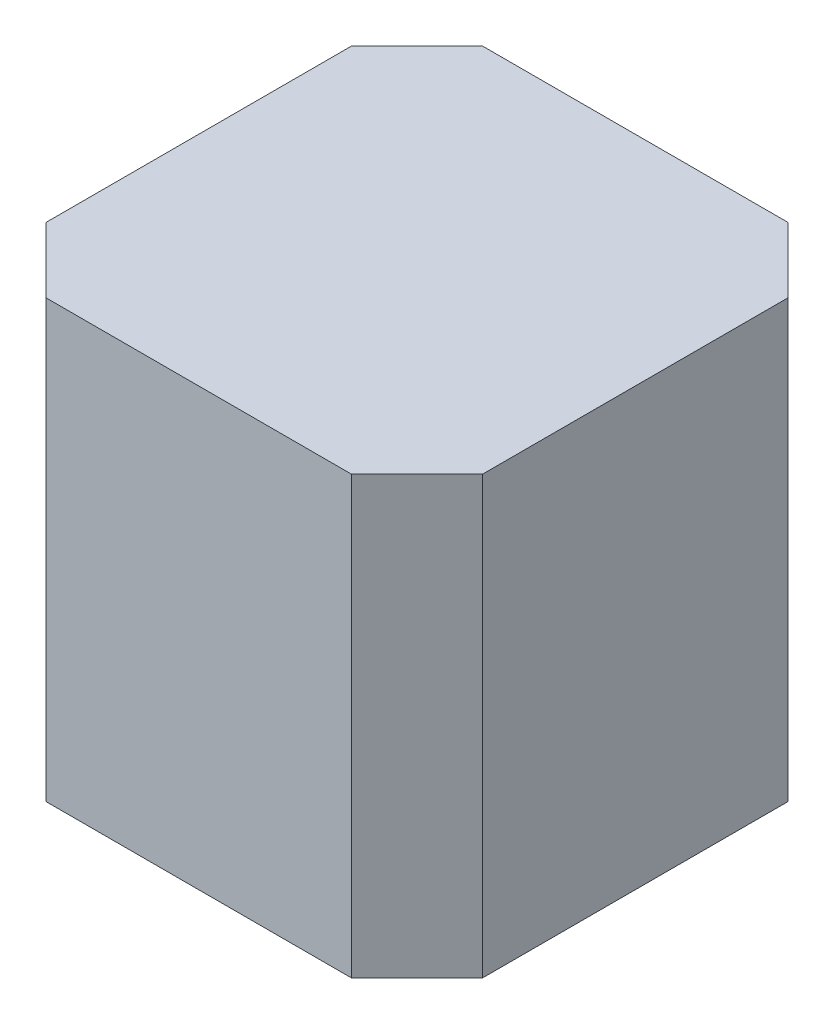
ISO-10303-21;
HEADER;
FILE_DESCRIPTION(('STEP AP214'),'2;1');
FILE_NAME('part.step','',(''),(''),'','','');
FILE_SCHEMA(('AUTOMOTIVE_DESIGN { 1 0 10303 214 1 1 1 1 }'));
ENDSEC;
DATA;
#1=APPLICATION_CONTEXT('core data for automotive mechanical design processes');
#2=APPLICATION_PROTOCOL_DEFINITION('international standard','automotive_design',2000,#1);
#3=PRODUCT_CONTEXT('',#1,'mechanical');
#4=PRODUCT('Part','Part','',(#3));
#5=PRODUCT_RELATED_PRODUCT_CATEGORY('part','',(#4));
#6=PRODUCT_DEFINITION_FORMATION('','',#4);
#7=PRODUCT_DEFINITION_CONTEXT('part definition',#1,'design');
#8=PRODUCT_DEFINITION('design','',#6,#7);
#9=PRODUCT_DEFINITION_SHAPE('','',#8);
#10=(LENGTH_UNIT() NAMED_UNIT(*) SI_UNIT(.MILLI.,.METRE.));
#11=(NAMED_UNIT(*) PLANE_ANGLE_UNIT() SI_UNIT($,.RADIAN.));
#12=(NAMED_UNIT(*) SI_UNIT($,.STERADIAN.) SOLID_ANGLE_UNIT());
#13=UNCERTAINTY_MEASURE_WITH_UNIT(LENGTH_MEASURE(1.E-05),#10,'distance_accuracy_value','');
#14=(GEOMETRIC_REPRESENTATION_CONTEXT(3) GLOBAL_UNCERTAINTY_ASSIGNED_CONTEXT((#13)) GLOBAL_UNIT_ASSIGNED_CONTEXT((#10,
#11,#12)) REPRESENTATION_CONTEXT('',''));
#15=CARTESIAN_POINT('',(0.,0.,0.));
#16=DIRECTION('',(0.,0.,1.));
#17=DIRECTION('',(1.,0.,0.));
#18=AXIS2_PLACEMENT_3D('',#15,#16,#17);
#19=CARTESIAN_POINT('',(-1.27,2.54,-1.27));
#20=DIRECTION('',(1.,0.,0.));
#21=DIRECTION('',(0.,0.,-1.));
#22=AXIS2_PLACEMENT_3D('',#19,#20,#21);
#23=PLANE('',#22);
#24=DIRECTION('',(0.,0.,1.));
#25=VECTOR('',#24,1.);
#26=CARTESIAN_POINT('',(-1.27,2.54,-1.27));
#27=LINE('',#26,#25);
#28=CARTESIAN_POINT('',(-1.27,2.54,-0.889));
#29=VERTEX_POINT('',#28);
#30=CARTESIAN_POINT('',(-1.27,2.54,0.888999999999998));
#31=VERTEX_POINT('',#30);
#32=EDGE_CURVE('E118',#29,#31,#27,.T.);
#33=ORIENTED_EDGE('',*,*,#32,.F.);
#34=DIRECTION('',(0.,-1.,0.));
#35=VECTOR('',#34,1.);
#36=CARTESIAN_POINT('',(-1.27,2.54,-0.889));
#37=LINE('',#36,#35);
#38=CARTESIAN_POINT('',(-1.27,0.,-0.889));
#39=VERTEX_POINT('',#38);
#40=EDGE_CURVE('E103',#29,#39,#37,.T.);
#41=ORIENTED_EDGE('',*,*,#40,.T.);
#42=DIRECTION('',(0.,0.,1.));
#43=VECTOR('',#42,1.);
#44=CARTESIAN_POINT('',(-1.27,0.,-1.27));
#45=LINE('',#44,#43);
#46=CARTESIAN_POINT('',(-1.27,0.,0.888999999999999));
#47=VERTEX_POINT('',#46);
#48=EDGE_CURVE('E115',#39,#47,#45,.T.);
#49=ORIENTED_EDGE('',*,*,#48,.T.);
#50=DIRECTION('',(0.,1.,0.));
#51=VECTOR('',#50,1.);
#52=CARTESIAN_POINT('',(-1.27,2.54,0.888999999999999));
#53=LINE('',#52,#51);
#54=EDGE_CURVE('E120',#47,#31,#53,.T.);
#55=ORIENTED_EDGE('',*,*,#54,.T.);
#56=EDGE_LOOP('',(#33,#41,#49,#55));
#57=FACE_BOUND('',#56,.T.);
#58=ADVANCED_FACE('F33',(#57),#23,.F.);
#59=CARTESIAN_POINT('',(-1.27,2.54,1.27));
#60=DIRECTION('',(0.,0.,-1.));
#61=DIRECTION('',(-1.,0.,0.));
#62=AXIS2_PLACEMENT_3D('',#59,#60,#61);
#63=PLANE('',#62);
#64=DIRECTION('',(1.,0.,0.));
#65=VECTOR('',#64,1.);
#66=CARTESIAN_POINT('',(-1.27,0.,1.27));
#67=LINE('',#66,#65);
#68=CARTESIAN_POINT('',(-0.889,0.,1.27));
#69=VERTEX_POINT('',#68);
#70=CARTESIAN_POINT('',(0.888999999999999,0.,1.27));
#71=VERTEX_POINT('',#70);
#72=EDGE_CURVE('E124',#69,#71,#67,.T.);
#73=ORIENTED_EDGE('',*,*,#72,.T.);
#74=DIRECTION('',(0.,1.,0.));
#75=VECTOR('',#74,1.);
#76=CARTESIAN_POINT('',(0.888999999999999,2.54,1.27));
#77=LINE('',#76,#75);
#78=CARTESIAN_POINT('',(0.888999999999999,2.54,1.27));
#79=VERTEX_POINT('',#78);
#80=EDGE_CURVE('E11',#71,#79,#77,.T.);
#81=ORIENTED_EDGE('',*,*,#80,.T.);
#82=DIRECTION('',(1.,0.,0.));
#83=VECTOR('',#82,1.);
#84=CARTESIAN_POINT('',(-1.27,2.54,1.27));
#85=LINE('',#84,#83);
#86=CARTESIAN_POINT('',(-0.889,2.54,1.27));
#87=VERTEX_POINT('',#86);
#88=EDGE_CURVE('E160',#87,#79,#85,.T.);
#89=ORIENTED_EDGE('',*,*,#88,.F.);
#90=DIRECTION('',(0.,-1.,0.));
#91=VECTOR('',#90,1.);
#92=CARTESIAN_POINT('',(-0.889,2.54,1.27));
#93=LINE('',#92,#91);
#94=EDGE_CURVE('E41',#87,#69,#93,.T.);
#95=ORIENTED_EDGE('',*,*,#94,.T.);
#96=EDGE_LOOP('',(#73,#81,#89,#95));
#97=FACE_BOUND('',#96,.T.);
#98=ADVANCED_FACE('F158',(#97),#63,.F.);
#99=CARTESIAN_POINT('',(1.27,2.54,-1.27));
#100=DIRECTION('',(-1.,0.,0.));
#101=DIRECTION('',(0.,0.,1.));
#102=AXIS2_PLACEMENT_3D('',#99,#100,#101);
#103=PLANE('',#102);
#104=DIRECTION('',(0.,0.,-1.));
#105=VECTOR('',#104,1.);
#106=CARTESIAN_POINT('',(1.27,0.,-1.27));
#107=LINE('',#106,#105);
#108=CARTESIAN_POINT('',(1.27,0.,0.888999999999999));
#109=VERTEX_POINT('',#108);
#110=CARTESIAN_POINT('',(1.27,0.,-0.888999999999999));
#111=VERTEX_POINT('',#110);
#112=EDGE_CURVE('E127',#109,#111,#107,.T.);
#113=ORIENTED_EDGE('',*,*,#112,.T.);
#114=DIRECTION('',(0.,1.,0.));
#115=VECTOR('',#114,1.);
#116=CARTESIAN_POINT('',(1.27,2.54,-0.888999999999999));
#117=LINE('',#116,#115);
#118=CARTESIAN_POINT('',(1.27,2.54,-0.888999999999999));
#119=VERTEX_POINT('',#118);
#120=EDGE_CURVE('E48',#111,#119,#117,.T.);
#121=ORIENTED_EDGE('',*,*,#120,.T.);
#122=DIRECTION('',(0.,0.,-1.));
#123=VECTOR('',#122,1.);
#124=CARTESIAN_POINT('',(1.27,2.54,-1.27));
#125=LINE('',#124,#123);
#126=CARTESIAN_POINT('',(1.27,2.54,0.889));
#127=VERTEX_POINT('',#126);
#128=EDGE_CURVE('E168',#127,#119,#125,.T.);
#129=ORIENTED_EDGE('',*,*,#128,.F.);
#130=DIRECTION('',(0.,-1.,0.));
#131=VECTOR('',#130,1.);
#132=CARTESIAN_POINT('',(1.27,2.54,0.889));
#133=LINE('',#132,#131);
#134=EDGE_CURVE('E151',#127,#109,#133,.T.);
#135=ORIENTED_EDGE('',*,*,#134,.T.);
#136=EDGE_LOOP('',(#113,#121,#129,#135));
#137=FACE_BOUND('',#136,.T.);
#138=ADVANCED_FACE('F167',(#137),#103,.F.);
#139=CARTESIAN_POINT('',(-1.27,2.54,-1.27));
#140=DIRECTION('',(0.,0.,1.));
#141=DIRECTION('',(1.,0.,0.));
#142=AXIS2_PLACEMENT_3D('',#139,#140,#141);
#143=PLANE('',#142);
#144=DIRECTION('',(-1.,0.,0.));
#145=VECTOR('',#144,1.);
#146=CARTESIAN_POINT('',(-1.27,0.,-1.27));
#147=LINE('',#146,#145);
#148=CARTESIAN_POINT('',(0.888999999999999,0.,-1.27));
#149=VERTEX_POINT('',#148);
#150=CARTESIAN_POINT('',(-0.888999999999999,0.,-1.27));
#151=VERTEX_POINT('',#150);
#152=EDGE_CURVE('E134',#149,#151,#147,.T.);
#153=ORIENTED_EDGE('',*,*,#152,.T.);
#154=DIRECTION('',(0.,1.,0.));
#155=VECTOR('',#154,1.);
#156=CARTESIAN_POINT('',(-0.888999999999999,2.54,-1.27));
#157=LINE('',#156,#155);
#158=CARTESIAN_POINT('',(-0.888999999999998,2.54,-1.27));
#159=VERTEX_POINT('',#158);
#160=EDGE_CURVE('E104',#151,#159,#157,.T.);
#161=ORIENTED_EDGE('',*,*,#160,.T.);
#162=DIRECTION('',(-1.,0.,0.));
#163=VECTOR('',#162,1.);
#164=CARTESIAN_POINT('',(-1.27,2.54,-1.27));
#165=LINE('',#164,#163);
#166=CARTESIAN_POINT('',(0.889,2.54,-1.27));
#167=VERTEX_POINT('',#166);
#168=EDGE_CURVE('E130',#167,#159,#165,.T.);
#169=ORIENTED_EDGE('',*,*,#168,.F.);
#170=DIRECTION('',(0.,-1.,0.));
#171=VECTOR('',#170,1.);
#172=CARTESIAN_POINT('',(0.889,2.54,-1.27));
#173=LINE('',#172,#171);
#174=EDGE_CURVE('E109',#167,#149,#173,.T.);
#175=ORIENTED_EDGE('',*,*,#174,.T.);
#176=EDGE_LOOP('',(#153,#161,#169,#175));
#177=FACE_BOUND('',#176,.T.);
#178=ADVANCED_FACE('F196',(#177),#143,.F.);
#179=CARTESIAN_POINT('',(-1.27,2.54,1.27));
#180=DIRECTION('',(0.,1.,0.));
#181=DIRECTION('',(0.,0.,1.));
#182=AXIS2_PLACEMENT_3D('',#179,#180,#181);
#183=PLANE('',#182);
#184=ORIENTED_EDGE('',*,*,#168,.T.);
#185=DIRECTION('',(0.707106781186549,0.,-0.707106781186546));
#186=VECTOR('',#185,1.);
#187=CARTESIAN_POINT('',(-2.3495,2.54,0.190499999999996));
#188=LINE('',#187,#186);
#189=EDGE_CURVE('E149',#159,#29,#188,.F.);
#190=ORIENTED_EDGE('',*,*,#189,.T.);
#191=ORIENTED_EDGE('',*,*,#32,.T.);
#192=DIRECTION('',(-0.707106781186546,0.,-0.707106781186549));
#193=VECTOR('',#192,1.);
#194=CARTESIAN_POINT('',(-1.0795,2.54,1.0795));
#195=LINE('',#194,#193);
#196=EDGE_CURVE('E144',#31,#87,#195,.F.);
#197=ORIENTED_EDGE('',*,*,#196,.T.);
#198=ORIENTED_EDGE('',*,*,#88,.T.);
#199=DIRECTION('',(-0.707106781186549,0.,0.707106781186546));
#200=VECTOR('',#199,1.);
#201=CARTESIAN_POINT('',(-0.190500000000005,2.54,2.3495));
#202=LINE('',#201,#200);
#203=EDGE_CURVE('E55',#79,#127,#202,.F.);
#204=ORIENTED_EDGE('',*,*,#203,.T.);
#205=ORIENTED_EDGE('',*,*,#128,.T.);
#206=DIRECTION('',(0.707106781186546,0.,0.707106781186549));
#207=VECTOR('',#206,1.);
#208=CARTESIAN_POINT('',(1.0795,2.54,-1.0795));
#209=LINE('',#208,#207);
#210=EDGE_CURVE('E147',#119,#167,#209,.F.);
#211=ORIENTED_EDGE('',*,*,#210,.T.);
#212=EDGE_LOOP('',(#184,#190,#191,#197,#198,#204,#205,#211));
#213=FACE_BOUND('',#212,.T.);
#214=ADVANCED_FACE('F173',(#213),#183,.T.);
#215=CARTESIAN_POINT('',(-1.27,0.,1.27));
#216=DIRECTION('',(0.,1.,0.));
#217=DIRECTION('',(0.,0.,1.));
#218=AXIS2_PLACEMENT_3D('',#215,#216,#217);
#219=PLANE('',#218);
#220=ORIENTED_EDGE('',*,*,#48,.F.);
#221=DIRECTION('',(-0.707106781186549,0.,0.707106781186546));
#222=VECTOR('',#221,1.);
#223=CARTESIAN_POINT('',(-1.27,0.,-0.889));
#224=LINE('',#223,#222);
#225=EDGE_CURVE('E99',#39,#151,#224,.F.);
#226=ORIENTED_EDGE('',*,*,#225,.T.);
#227=ORIENTED_EDGE('',*,*,#152,.F.);
#228=DIRECTION('',(-0.707106781186546,0.,-0.707106781186549));
#229=VECTOR('',#228,1.);
#230=CARTESIAN_POINT('',(0.889,0.,-1.27));
#231=LINE('',#230,#229);
#232=EDGE_CURVE('E110',#149,#111,#231,.F.);
#233=ORIENTED_EDGE('',*,*,#232,.T.);
#234=ORIENTED_EDGE('',*,*,#112,.F.);
#235=DIRECTION('',(0.707106781186549,0.,-0.707106781186546));
#236=VECTOR('',#235,1.);
#237=CARTESIAN_POINT('',(1.27,0.,0.889));
#238=LINE('',#237,#236);
#239=EDGE_CURVE('E138',#109,#71,#238,.F.);
#240=ORIENTED_EDGE('',*,*,#239,.T.);
#241=ORIENTED_EDGE('',*,*,#72,.F.);
#242=DIRECTION('',(0.707106781186546,0.,0.707106781186549));
#243=VECTOR('',#242,1.);
#244=CARTESIAN_POINT('',(-0.889,0.,1.27));
#245=LINE('',#244,#243);
#246=EDGE_CURVE('E119',#69,#47,#245,.F.);
#247=ORIENTED_EDGE('',*,*,#246,.T.);
#248=EDGE_LOOP('',(#220,#226,#227,#233,#234,#240,#241,#247));
#249=FACE_BOUND('',#248,.T.);
#250=ADVANCED_FACE('F122',(#249),#219,.F.);
#251=CARTESIAN_POINT('',(-1.27,2.54,-0.889));
#252=DIRECTION('',(0.707106781186546,0.,0.707106781186549));
#253=DIRECTION('',(0.707106781186549,0.,-0.707106781186546));
#254=AXIS2_PLACEMENT_3D('',#251,#252,#253);
#255=PLANE('',#254);
#256=ORIENTED_EDGE('',*,*,#189,.F.);
#257=ORIENTED_EDGE('',*,*,#160,.F.);
#258=ORIENTED_EDGE('',*,*,#225,.F.);
#259=ORIENTED_EDGE('',*,*,#40,.F.);
#260=EDGE_LOOP('',(#256,#257,#258,#259));
#261=FACE_BOUND('',#260,.T.);
#262=ADVANCED_FACE('F102',(#261),#255,.F.);
#263=CARTESIAN_POINT('',(0.889,2.54,-1.27));
#264=DIRECTION('',(-0.707106781186549,0.,0.707106781186546));
#265=DIRECTION('',(0.707106781186546,0.,0.707106781186549));
#266=AXIS2_PLACEMENT_3D('',#263,#264,#265);
#267=PLANE('',#266);
#268=ORIENTED_EDGE('',*,*,#210,.F.);
#269=ORIENTED_EDGE('',*,*,#120,.F.);
#270=ORIENTED_EDGE('',*,*,#232,.F.);
#271=ORIENTED_EDGE('',*,*,#174,.F.);
#272=EDGE_LOOP('',(#268,#269,#270,#271));
#273=FACE_BOUND('',#272,.T.);
#274=ADVANCED_FACE('F178',(#273),#267,.F.);
#275=CARTESIAN_POINT('',(1.27,2.54,0.889));
#276=DIRECTION('',(-0.707106781186546,0.,-0.707106781186549));
#277=DIRECTION('',(-0.707106781186549,0.,0.707106781186546));
#278=AXIS2_PLACEMENT_3D('',#275,#276,#277);
#279=PLANE('',#278);
#280=ORIENTED_EDGE('',*,*,#203,.F.);
#281=ORIENTED_EDGE('',*,*,#80,.F.);
#282=ORIENTED_EDGE('',*,*,#239,.F.);
#283=ORIENTED_EDGE('',*,*,#134,.F.);
#284=EDGE_LOOP('',(#280,#281,#282,#283));
#285=FACE_BOUND('',#284,.T.);
#286=ADVANCED_FACE('F166',(#285),#279,.F.);
#287=CARTESIAN_POINT('',(-0.889,2.54,1.27));
#288=DIRECTION('',(0.707106781186549,0.,-0.707106781186546));
#289=DIRECTION('',(-0.707106781186546,0.,-0.707106781186549));
#290=AXIS2_PLACEMENT_3D('',#287,#288,#289);
#291=PLANE('',#290);
#292=ORIENTED_EDGE('',*,*,#196,.F.);
#293=ORIENTED_EDGE('',*,*,#54,.F.);
#294=ORIENTED_EDGE('',*,*,#246,.F.);
#295=ORIENTED_EDGE('',*,*,#94,.F.);
#296=EDGE_LOOP('',(#292,#293,#294,#295));
#297=FACE_BOUND('',#296,.T.);
#298=ADVANCED_FACE('F35',(#297),#291,.F.);
#299=CLOSED_SHELL('',(#58,#98,#138,#178,#214,#250,#262,#274,#286,#298));
#300=MANIFOLD_SOLID_BREP('B2',#299);
#301=ADVANCED_BREP_SHAPE_REPRESENTATION('',(#18,#300),#14);
#302=SHAPE_DEFINITION_REPRESENTATION(#9,#301);
ENDSEC;
END-ISO-10303-21;
